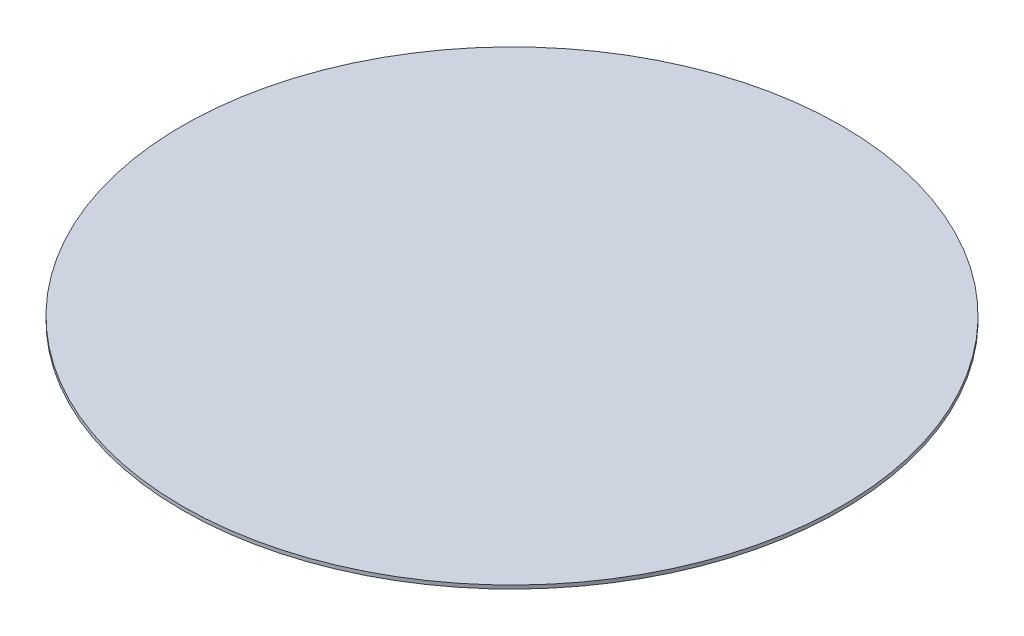
ISO-10303-21;
HEADER;
FILE_DESCRIPTION(('STEP AP214'),'2;1');
FILE_NAME('part.step','',(''),(''),'','','');
FILE_SCHEMA(('AUTOMOTIVE_DESIGN { 1 0 10303 214 1 1 1 1 }'));
ENDSEC;
DATA;
#1=APPLICATION_CONTEXT('core data for automotive mechanical design processes');
#2=APPLICATION_PROTOCOL_DEFINITION('international standard','automotive_design',2000,#1);
#3=PRODUCT_CONTEXT('',#1,'mechanical');
#4=PRODUCT('Part','Part','',(#3));
#5=PRODUCT_RELATED_PRODUCT_CATEGORY('part','',(#4));
#6=PRODUCT_DEFINITION_FORMATION('','',#4);
#7=PRODUCT_DEFINITION_CONTEXT('part definition',#1,'design');
#8=PRODUCT_DEFINITION('design','',#6,#7);
#9=PRODUCT_DEFINITION_SHAPE('','',#8);
#10=(LENGTH_UNIT() NAMED_UNIT(*) SI_UNIT(.MILLI.,.METRE.));
#11=(NAMED_UNIT(*) PLANE_ANGLE_UNIT() SI_UNIT($,.RADIAN.));
#12=(NAMED_UNIT(*) SI_UNIT($,.STERADIAN.) SOLID_ANGLE_UNIT());
#13=UNCERTAINTY_MEASURE_WITH_UNIT(LENGTH_MEASURE(1.E-05),#10,'distance_accuracy_value','');
#14=(GEOMETRIC_REPRESENTATION_CONTEXT(3) GLOBAL_UNCERTAINTY_ASSIGNED_CONTEXT((#13)) GLOBAL_UNIT_ASSIGNED_CONTEXT((#10,
#11,#12)) REPRESENTATION_CONTEXT('',''));
#15=CARTESIAN_POINT('',(0.,0.,0.));
#16=DIRECTION('',(0.,0.,1.));
#17=DIRECTION('',(1.,0.,0.));
#18=AXIS2_PLACEMENT_3D('',#15,#16,#17);
#19=CARTESIAN_POINT('',(0.,1.6,0.));
#20=DIRECTION('',(0.,-1.,0.));
#21=DIRECTION('',(0.,0.,-1.));
#22=AXIS2_PLACEMENT_3D('',#19,#20,#21);
#23=CYLINDRICAL_SURFACE('',#22,150.);
#24=CARTESIAN_POINT('',(0.,1.6,0.));
#25=DIRECTION('',(0.,1.,0.));
#26=DIRECTION('',(0.,0.,1.));
#27=AXIS2_PLACEMENT_3D('',#24,#25,#26);
#28=CIRCLE('',#27,150.);
#29=CARTESIAN_POINT('',(0.,1.6,150.));
#30=VERTEX_POINT('',#29);
#31=EDGE_CURVE('E10',#30,#30,#28,.T.);
#32=ORIENTED_EDGE('',*,*,#31,.F.);
#33=EDGE_LOOP('',(#32));
#34=FACE_BOUND('',#33,.T.);
#35=CARTESIAN_POINT('',(0.,0.,0.));
#36=DIRECTION('',(0.,1.,0.));
#37=DIRECTION('',(0.,0.,1.));
#38=AXIS2_PLACEMENT_3D('',#35,#36,#37);
#39=CIRCLE('',#38,150.);
#40=CARTESIAN_POINT('',(0.,0.,150.));
#41=VERTEX_POINT('',#40);
#42=EDGE_CURVE('E34',#41,#41,#39,.T.);
#43=ORIENTED_EDGE('',*,*,#42,.T.);
#44=EDGE_LOOP('',(#43));
#45=FACE_BOUND('',#44,.T.);
#46=ADVANCED_FACE('F31',(#34,#45),#23,.T.);
#47=CARTESIAN_POINT('',(0.,1.6,0.));
#48=DIRECTION('',(0.,1.,0.));
#49=DIRECTION('',(0.,0.,1.));
#50=AXIS2_PLACEMENT_3D('',#47,#48,#49);
#51=PLANE('',#50);
#52=ORIENTED_EDGE('',*,*,#31,.T.);
#53=EDGE_LOOP('',(#52));
#54=FACE_BOUND('',#53,.T.);
#55=ADVANCED_FACE('F46',(#54),#51,.T.);
#56=CARTESIAN_POINT('',(0.,0.,0.));
#57=DIRECTION('',(0.,1.,0.));
#58=DIRECTION('',(0.,0.,1.));
#59=AXIS2_PLACEMENT_3D('',#56,#57,#58);
#60=PLANE('',#59);
#61=ORIENTED_EDGE('',*,*,#42,.F.);
#62=EDGE_LOOP('',(#61));
#63=FACE_BOUND('',#62,.T.);
#64=ADVANCED_FACE('F44',(#63),#60,.F.);
#65=CLOSED_SHELL('',(#46,#55,#64));
#66=MANIFOLD_SOLID_BREP('B2',#65);
#67=ADVANCED_BREP_SHAPE_REPRESENTATION('',(#18,#66),#14);
#68=SHAPE_DEFINITION_REPRESENTATION(#9,#67);
ENDSEC;
END-ISO-10303-21;
